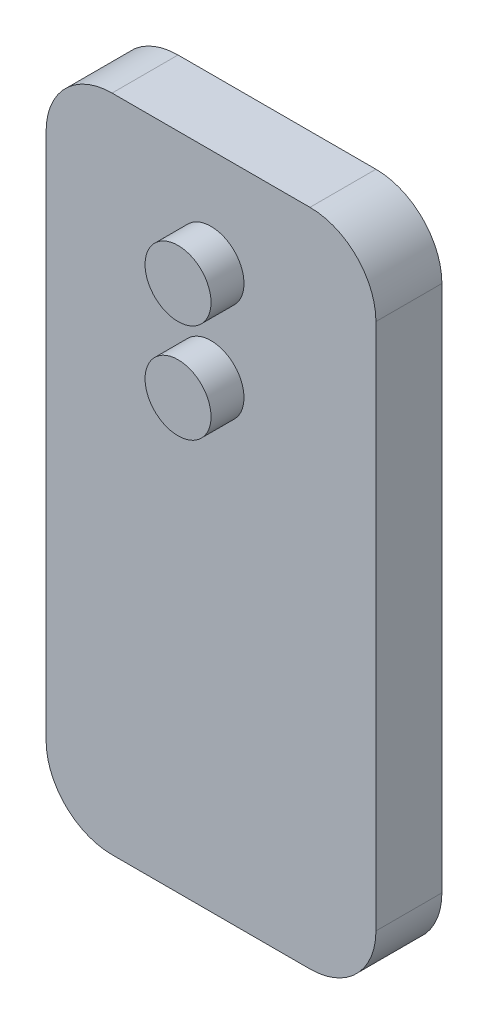
ISO-10303-21;
HEADER;
FILE_DESCRIPTION(('STEP AP214'),'2;1');
FILE_NAME('part.step','',(''),(''),'','','');
FILE_SCHEMA(('AUTOMOTIVE_DESIGN { 1 0 10303 214 1 1 1 1 }'));
ENDSEC;
DATA;
#1=APPLICATION_CONTEXT('core data for automotive mechanical design processes');
#2=APPLICATION_PROTOCOL_DEFINITION('international standard','automotive_design',2000,#1);
#3=PRODUCT_CONTEXT('',#1,'mechanical');
#4=PRODUCT('Part','Part','',(#3));
#5=PRODUCT_RELATED_PRODUCT_CATEGORY('part','',(#4));
#6=PRODUCT_DEFINITION_FORMATION('','',#4);
#7=PRODUCT_DEFINITION_CONTEXT('part definition',#1,'design');
#8=PRODUCT_DEFINITION('design','',#6,#7);
#9=PRODUCT_DEFINITION_SHAPE('','',#8);
#10=(LENGTH_UNIT() NAMED_UNIT(*) SI_UNIT(.MILLI.,.METRE.));
#11=(NAMED_UNIT(*) PLANE_ANGLE_UNIT() SI_UNIT($,.RADIAN.));
#12=(NAMED_UNIT(*) SI_UNIT($,.STERADIAN.) SOLID_ANGLE_UNIT());
#13=UNCERTAINTY_MEASURE_WITH_UNIT(LENGTH_MEASURE(1.E-05),#10,'distance_accuracy_value','');
#14=(GEOMETRIC_REPRESENTATION_CONTEXT(3) GLOBAL_UNCERTAINTY_ASSIGNED_CONTEXT((#13)) GLOBAL_UNIT_ASSIGNED_CONTEXT((#10,
#11,#12)) REPRESENTATION_CONTEXT('',''));
#15=CARTESIAN_POINT('',(0.,0.,0.));
#16=DIRECTION('',(0.,0.,1.));
#17=DIRECTION('',(1.,0.,0.));
#18=AXIS2_PLACEMENT_3D('',#15,#16,#17);
#19=CARTESIAN_POINT('',(-15.,10.,10.));
#20=DIRECTION('',(0.,0.,-1.));
#21=DIRECTION('',(-1.,0.,0.));
#22=AXIS2_PLACEMENT_3D('',#19,#20,#21);
#23=CYLINDRICAL_SURFACE('',#22,10.);
#24=CARTESIAN_POINT('',(-15.,10.,0.));
#25=DIRECTION('',(0.,0.,1.));
#26=DIRECTION('',(-1.,0.,0.));
#27=AXIS2_PLACEMENT_3D('',#24,#25,#26);
#28=CIRCLE('',#27,10.);
#29=CARTESIAN_POINT('',(-25.,10.,0.));
#30=VERTEX_POINT('',#29);
#31=CARTESIAN_POINT('',(-15.,0.,0.));
#32=VERTEX_POINT('',#31);
#33=EDGE_CURVE('E129',#30,#32,#28,.T.);
#34=ORIENTED_EDGE('',*,*,#33,.T.);
#35=DIRECTION('',(0.,0.,-1.));
#36=VECTOR('',#35,1.);
#37=CARTESIAN_POINT('',(-15.,0.,10.));
#38=LINE('',#37,#36);
#39=CARTESIAN_POINT('',(-15.,0.,10.));
#40=VERTEX_POINT('',#39);
#41=EDGE_CURVE('E157',#40,#32,#38,.T.);
#42=ORIENTED_EDGE('',*,*,#41,.F.);
#43=CARTESIAN_POINT('',(-15.,10.,10.));
#44=DIRECTION('',(0.,0.,1.));
#45=DIRECTION('',(-1.,0.,0.));
#46=AXIS2_PLACEMENT_3D('',#43,#44,#45);
#47=CIRCLE('',#46,10.);
#48=CARTESIAN_POINT('',(-25.,10.,10.));
#49=VERTEX_POINT('',#48);
#50=EDGE_CURVE('E144',#49,#40,#47,.T.);
#51=ORIENTED_EDGE('',*,*,#50,.F.);
#52=DIRECTION('',(0.,0.,-1.));
#53=VECTOR('',#52,1.);
#54=CARTESIAN_POINT('',(-25.,10.,10.));
#55=LINE('',#54,#53);
#56=EDGE_CURVE('E125',#49,#30,#55,.T.);
#57=ORIENTED_EDGE('',*,*,#56,.T.);
#58=EDGE_LOOP('',(#34,#42,#51,#57));
#59=FACE_BOUND('',#58,.T.);
#60=ADVANCED_FACE('F32',(#59),#23,.T.);
#61=CARTESIAN_POINT('',(-15.,0.,10.));
#62=DIRECTION('',(0.,1.,0.));
#63=DIRECTION('',(-1.,0.,0.));
#64=AXIS2_PLACEMENT_3D('',#61,#62,#63);
#65=PLANE('',#64);
#66=DIRECTION('',(1.,0.,0.));
#67=VECTOR('',#66,1.);
#68=CARTESIAN_POINT('',(-15.,0.,0.));
#69=LINE('',#68,#67);
#70=CARTESIAN_POINT('',(15.,0.,0.));
#71=VERTEX_POINT('',#70);
#72=EDGE_CURVE('E132',#32,#71,#69,.T.);
#73=ORIENTED_EDGE('',*,*,#72,.T.);
#74=DIRECTION('',(0.,0.,-1.));
#75=VECTOR('',#74,1.);
#76=CARTESIAN_POINT('',(15.,0.,10.));
#77=LINE('',#76,#75);
#78=CARTESIAN_POINT('',(15.,0.,10.));
#79=VERTEX_POINT('',#78);
#80=EDGE_CURVE('E154',#79,#71,#77,.T.);
#81=ORIENTED_EDGE('',*,*,#80,.F.);
#82=DIRECTION('',(1.,0.,0.));
#83=VECTOR('',#82,1.);
#84=CARTESIAN_POINT('',(-15.,0.,10.));
#85=LINE('',#84,#83);
#86=EDGE_CURVE('E92',#40,#79,#85,.T.);
#87=ORIENTED_EDGE('',*,*,#86,.F.);
#88=ORIENTED_EDGE('',*,*,#41,.T.);
#89=EDGE_LOOP('',(#73,#81,#87,#88));
#90=FACE_BOUND('',#89,.T.);
#91=ADVANCED_FACE('F178',(#90),#65,.F.);
#92=CARTESIAN_POINT('',(15.,10.,10.));
#93=DIRECTION('',(0.,0.,-1.));
#94=DIRECTION('',(-1.,0.,0.));
#95=AXIS2_PLACEMENT_3D('',#92,#93,#94);
#96=CYLINDRICAL_SURFACE('',#95,10.);
#97=CARTESIAN_POINT('',(15.,10.,0.));
#98=DIRECTION('',(0.,0.,1.));
#99=DIRECTION('',(1.,0.,0.));
#100=AXIS2_PLACEMENT_3D('',#97,#98,#99);
#101=CIRCLE('',#100,10.);
#102=CARTESIAN_POINT('',(25.,10.,0.));
#103=VERTEX_POINT('',#102);
#104=EDGE_CURVE('E135',#71,#103,#101,.T.);
#105=ORIENTED_EDGE('',*,*,#104,.T.);
#106=DIRECTION('',(0.,0.,-1.));
#107=VECTOR('',#106,1.);
#108=CARTESIAN_POINT('',(25.,10.,10.));
#109=LINE('',#108,#107);
#110=CARTESIAN_POINT('',(25.,10.,10.));
#111=VERTEX_POINT('',#110);
#112=EDGE_CURVE('E151',#111,#103,#109,.T.);
#113=ORIENTED_EDGE('',*,*,#112,.F.);
#114=CARTESIAN_POINT('',(15.,10.,10.));
#115=DIRECTION('',(0.,0.,1.));
#116=DIRECTION('',(1.,0.,0.));
#117=AXIS2_PLACEMENT_3D('',#114,#115,#116);
#118=CIRCLE('',#117,10.);
#119=EDGE_CURVE('E192',#79,#111,#118,.T.);
#120=ORIENTED_EDGE('',*,*,#119,.F.);
#121=ORIENTED_EDGE('',*,*,#80,.T.);
#122=EDGE_LOOP('',(#105,#113,#120,#121));
#123=FACE_BOUND('',#122,.T.);
#124=ADVANCED_FACE('F183',(#123),#96,.T.);
#125=CARTESIAN_POINT('',(25.,10.,10.));
#126=DIRECTION('',(-1.,0.,0.));
#127=DIRECTION('',(0.,-1.,0.));
#128=AXIS2_PLACEMENT_3D('',#125,#126,#127);
#129=PLANE('',#128);
#130=DIRECTION('',(0.,1.,0.));
#131=VECTOR('',#130,1.);
#132=CARTESIAN_POINT('',(25.,10.,0.));
#133=LINE('',#132,#131);
#134=CARTESIAN_POINT('',(25.,90.,0.));
#135=VERTEX_POINT('',#134);
#136=EDGE_CURVE('E137',#103,#135,#133,.T.);
#137=ORIENTED_EDGE('',*,*,#136,.T.);
#138=DIRECTION('',(0.,0.,-1.));
#139=VECTOR('',#138,1.);
#140=CARTESIAN_POINT('',(25.,90.,10.));
#141=LINE('',#140,#139);
#142=CARTESIAN_POINT('',(25.,90.,10.));
#143=VERTEX_POINT('',#142);
#144=EDGE_CURVE('E148',#143,#135,#141,.T.);
#145=ORIENTED_EDGE('',*,*,#144,.F.);
#146=DIRECTION('',(0.,1.,0.));
#147=VECTOR('',#146,1.);
#148=CARTESIAN_POINT('',(25.,10.,10.));
#149=LINE('',#148,#147);
#150=EDGE_CURVE('E194',#111,#143,#149,.T.);
#151=ORIENTED_EDGE('',*,*,#150,.F.);
#152=ORIENTED_EDGE('',*,*,#112,.T.);
#153=EDGE_LOOP('',(#137,#145,#151,#152));
#154=FACE_BOUND('',#153,.T.);
#155=ADVANCED_FACE('F281',(#154),#129,.F.);
#156=CARTESIAN_POINT('',(15.,90.,10.));
#157=DIRECTION('',(0.,0.,-1.));
#158=DIRECTION('',(-1.,0.,0.));
#159=AXIS2_PLACEMENT_3D('',#156,#157,#158);
#160=CYLINDRICAL_SURFACE('',#159,9.99999999999999);
#161=CARTESIAN_POINT('',(15.,90.,0.));
#162=DIRECTION('',(0.,0.,1.));
#163=DIRECTION('',(-1.,0.,0.));
#164=AXIS2_PLACEMENT_3D('',#161,#162,#163);
#165=CIRCLE('',#164,9.99999999999999);
#166=CARTESIAN_POINT('',(15.,100.,0.));
#167=VERTEX_POINT('',#166);
#168=EDGE_CURVE('E139',#135,#167,#165,.T.);
#169=ORIENTED_EDGE('',*,*,#168,.T.);
#170=DIRECTION('',(0.,0.,-1.));
#171=VECTOR('',#170,1.);
#172=CARTESIAN_POINT('',(15.,100.,10.));
#173=LINE('',#172,#171);
#174=CARTESIAN_POINT('',(15.,100.,10.));
#175=VERTEX_POINT('',#174);
#176=EDGE_CURVE('E120',#175,#167,#173,.T.);
#177=ORIENTED_EDGE('',*,*,#176,.F.);
#178=CARTESIAN_POINT('',(15.,90.,10.));
#179=DIRECTION('',(0.,0.,1.));
#180=DIRECTION('',(-1.,0.,0.));
#181=AXIS2_PLACEMENT_3D('',#178,#179,#180);
#182=CIRCLE('',#181,9.99999999999999);
#183=EDGE_CURVE('E111',#143,#175,#182,.T.);
#184=ORIENTED_EDGE('',*,*,#183,.F.);
#185=ORIENTED_EDGE('',*,*,#144,.T.);
#186=EDGE_LOOP('',(#169,#177,#184,#185));
#187=FACE_BOUND('',#186,.T.);
#188=ADVANCED_FACE('F273',(#187),#160,.T.);
#189=CARTESIAN_POINT('',(15.,100.,10.));
#190=DIRECTION('',(0.,-1.,0.));
#191=DIRECTION('',(0.,0.,-1.));
#192=AXIS2_PLACEMENT_3D('',#189,#190,#191);
#193=PLANE('',#192);
#194=DIRECTION('',(-1.,0.,0.));
#195=VECTOR('',#194,1.);
#196=CARTESIAN_POINT('',(15.,100.,0.));
#197=LINE('',#196,#195);
#198=CARTESIAN_POINT('',(-15.,100.,0.));
#199=VERTEX_POINT('',#198);
#200=EDGE_CURVE('E119',#167,#199,#197,.T.);
#201=ORIENTED_EDGE('',*,*,#200,.T.);
#202=DIRECTION('',(0.,0.,-1.));
#203=VECTOR('',#202,1.);
#204=CARTESIAN_POINT('',(-15.,100.,10.));
#205=LINE('',#204,#203);
#206=CARTESIAN_POINT('',(-15.,100.,10.));
#207=VERTEX_POINT('',#206);
#208=EDGE_CURVE('E116',#207,#199,#205,.T.);
#209=ORIENTED_EDGE('',*,*,#208,.F.);
#210=DIRECTION('',(-1.,0.,0.));
#211=VECTOR('',#210,1.);
#212=CARTESIAN_POINT('',(15.,100.,10.));
#213=LINE('',#212,#211);
#214=EDGE_CURVE('E105',#175,#207,#213,.T.);
#215=ORIENTED_EDGE('',*,*,#214,.F.);
#216=ORIENTED_EDGE('',*,*,#176,.T.);
#217=EDGE_LOOP('',(#201,#209,#215,#216));
#218=FACE_BOUND('',#217,.T.);
#219=ADVANCED_FACE('F117',(#218),#193,.F.);
#220=CARTESIAN_POINT('',(-15.,90.,10.));
#221=DIRECTION('',(0.,0.,-1.));
#222=DIRECTION('',(-1.,0.,0.));
#223=AXIS2_PLACEMENT_3D('',#220,#221,#222);
#224=CYLINDRICAL_SURFACE('',#223,9.99999999999999);
#225=CARTESIAN_POINT('',(-15.,90.,0.));
#226=DIRECTION('',(0.,0.,1.));
#227=DIRECTION('',(-1.,0.,0.));
#228=AXIS2_PLACEMENT_3D('',#225,#226,#227);
#229=CIRCLE('',#228,9.99999999999999);
#230=CARTESIAN_POINT('',(-25.,90.,0.));
#231=VERTEX_POINT('',#230);
#232=EDGE_CURVE('E77',#199,#231,#229,.T.);
#233=ORIENTED_EDGE('',*,*,#232,.T.);
#234=DIRECTION('',(0.,0.,-1.));
#235=VECTOR('',#234,1.);
#236=CARTESIAN_POINT('',(-25.,90.,10.));
#237=LINE('',#236,#235);
#238=CARTESIAN_POINT('',(-25.,90.,10.));
#239=VERTEX_POINT('',#238);
#240=EDGE_CURVE('E121',#239,#231,#237,.T.);
#241=ORIENTED_EDGE('',*,*,#240,.F.);
#242=CARTESIAN_POINT('',(-15.,90.,10.));
#243=DIRECTION('',(0.,0.,1.));
#244=DIRECTION('',(-1.,0.,0.));
#245=AXIS2_PLACEMENT_3D('',#242,#243,#244);
#246=CIRCLE('',#245,9.99999999999999);
#247=EDGE_CURVE('E109',#207,#239,#246,.T.);
#248=ORIENTED_EDGE('',*,*,#247,.F.);
#249=ORIENTED_EDGE('',*,*,#208,.T.);
#250=EDGE_LOOP('',(#233,#241,#248,#249));
#251=FACE_BOUND('',#250,.T.);
#252=ADVANCED_FACE('F123',(#251),#224,.T.);
#253=CARTESIAN_POINT('',(-25.,90.,10.));
#254=DIRECTION('',(1.,0.,0.));
#255=DIRECTION('',(0.,1.,0.));
#256=AXIS2_PLACEMENT_3D('',#253,#254,#255);
#257=PLANE('',#256);
#258=DIRECTION('',(0.,-1.,0.));
#259=VECTOR('',#258,1.);
#260=CARTESIAN_POINT('',(-25.,90.,0.));
#261=LINE('',#260,#259);
#262=EDGE_CURVE('E83',#231,#30,#261,.T.);
#263=ORIENTED_EDGE('',*,*,#262,.T.);
#264=ORIENTED_EDGE('',*,*,#56,.F.);
#265=DIRECTION('',(0.,-1.,0.));
#266=VECTOR('',#265,1.);
#267=CARTESIAN_POINT('',(-25.,90.,10.));
#268=LINE('',#267,#266);
#269=EDGE_CURVE('E48',#239,#49,#268,.T.);
#270=ORIENTED_EDGE('',*,*,#269,.F.);
#271=ORIENTED_EDGE('',*,*,#240,.T.);
#272=EDGE_LOOP('',(#263,#264,#270,#271));
#273=FACE_BOUND('',#272,.T.);
#274=ADVANCED_FACE('F165',(#273),#257,.F.);
#275=CARTESIAN_POINT('',(-15.,10.,10.));
#276=DIRECTION('',(0.,0.,-1.));
#277=DIRECTION('',(-1.,0.,0.));
#278=AXIS2_PLACEMENT_3D('',#275,#276,#277);
#279=PLANE('',#278);
#280=CARTESIAN_POINT('',(0.,70.,10.));
#281=DIRECTION('',(0.,0.,-1.));
#282=DIRECTION('',(-1.,0.,0.));
#283=AXIS2_PLACEMENT_3D('',#280,#281,#282);
#284=CIRCLE('',#283,5.);
#285=CARTESIAN_POINT('',(-5.,70.,10.));
#286=VERTEX_POINT('',#285);
#287=EDGE_CURVE('E11',#286,#286,#284,.F.);
#288=ORIENTED_EDGE('',*,*,#287,.F.);
#289=EDGE_LOOP('',(#288));
#290=FACE_BOUND('',#289,.T.);
#291=CARTESIAN_POINT('',(0.,85.,10.));
#292=DIRECTION('',(0.,0.,-1.));
#293=DIRECTION('',(-1.,0.,0.));
#294=AXIS2_PLACEMENT_3D('',#291,#292,#293);
#295=CIRCLE('',#294,5.);
#296=CARTESIAN_POINT('',(-5.,85.,10.));
#297=VERTEX_POINT('',#296);
#298=EDGE_CURVE('E40',#297,#297,#295,.F.);
#299=ORIENTED_EDGE('',*,*,#298,.F.);
#300=EDGE_LOOP('',(#299));
#301=FACE_BOUND('',#300,.T.);
#302=ORIENTED_EDGE('',*,*,#50,.T.);
#303=ORIENTED_EDGE('',*,*,#86,.T.);
#304=ORIENTED_EDGE('',*,*,#119,.T.);
#305=ORIENTED_EDGE('',*,*,#150,.T.);
#306=ORIENTED_EDGE('',*,*,#183,.T.);
#307=ORIENTED_EDGE('',*,*,#214,.T.);
#308=ORIENTED_EDGE('',*,*,#247,.T.);
#309=ORIENTED_EDGE('',*,*,#269,.T.);
#310=EDGE_LOOP('',(#302,#303,#304,#305,#306,#307,#308,#309));
#311=FACE_BOUND('',#310,.T.);
#312=ADVANCED_FACE('F107',(#290,#301,#311),#279,.F.);
#313=CARTESIAN_POINT('',(-15.,10.,0.));
#314=DIRECTION('',(0.,0.,-1.));
#315=DIRECTION('',(-1.,0.,0.));
#316=AXIS2_PLACEMENT_3D('',#313,#314,#315);
#317=PLANE('',#316);
#318=ORIENTED_EDGE('',*,*,#33,.F.);
#319=ORIENTED_EDGE('',*,*,#262,.F.);
#320=ORIENTED_EDGE('',*,*,#232,.F.);
#321=ORIENTED_EDGE('',*,*,#200,.F.);
#322=ORIENTED_EDGE('',*,*,#168,.F.);
#323=ORIENTED_EDGE('',*,*,#136,.F.);
#324=ORIENTED_EDGE('',*,*,#104,.F.);
#325=ORIENTED_EDGE('',*,*,#72,.F.);
#326=EDGE_LOOP('',(#318,#319,#320,#321,#322,#323,#324,#325));
#327=FACE_BOUND('',#326,.T.);
#328=ADVANCED_FACE('F164',(#327),#317,.T.);
#329=CARTESIAN_POINT('',(0.,85.,15.));
#330=DIRECTION('',(0.,0.,-1.));
#331=DIRECTION('',(-1.,0.,0.));
#332=AXIS2_PLACEMENT_3D('',#329,#330,#331);
#333=CYLINDRICAL_SURFACE('',#332,5.);
#334=CARTESIAN_POINT('',(0.,85.,15.));
#335=DIRECTION('',(0.,0.,1.));
#336=DIRECTION('',(1.,0.,0.));
#337=AXIS2_PLACEMENT_3D('',#334,#335,#336);
#338=CIRCLE('',#337,5.);
#339=CARTESIAN_POINT('',(5.,85.,15.));
#340=VERTEX_POINT('',#339);
#341=EDGE_CURVE('E133',#340,#340,#338,.T.);
#342=ORIENTED_EDGE('',*,*,#341,.F.);
#343=EDGE_LOOP('',(#342));
#344=FACE_BOUND('',#343,.T.);
#345=ORIENTED_EDGE('',*,*,#298,.T.);
#346=EDGE_LOOP('',(#345));
#347=FACE_BOUND('',#346,.T.);
#348=ADVANCED_FACE('F161',(#344,#347),#333,.T.);
#349=CARTESIAN_POINT('',(0.,85.,15.));
#350=DIRECTION('',(0.,0.,1.));
#351=DIRECTION('',(1.,0.,0.));
#352=AXIS2_PLACEMENT_3D('',#349,#350,#351);
#353=PLANE('',#352);
#354=ORIENTED_EDGE('',*,*,#341,.T.);
#355=EDGE_LOOP('',(#354));
#356=FACE_BOUND('',#355,.T.);
#357=ADVANCED_FACE('F211',(#356),#353,.T.);
#358=CARTESIAN_POINT('',(0.,70.,15.));
#359=DIRECTION('',(0.,0.,-1.));
#360=DIRECTION('',(-1.,0.,0.));
#361=AXIS2_PLACEMENT_3D('',#358,#359,#360);
#362=CYLINDRICAL_SURFACE('',#361,5.);
#363=CARTESIAN_POINT('',(0.,70.,15.));
#364=DIRECTION('',(0.,0.,1.));
#365=DIRECTION('',(1.,0.,0.));
#366=AXIS2_PLACEMENT_3D('',#363,#364,#365);
#367=CIRCLE('',#366,5.);
#368=CARTESIAN_POINT('',(5.00000000000001,70.,15.));
#369=VERTEX_POINT('',#368);
#370=EDGE_CURVE('E202',#369,#369,#367,.T.);
#371=ORIENTED_EDGE('',*,*,#370,.F.);
#372=EDGE_LOOP('',(#371));
#373=FACE_BOUND('',#372,.T.);
#374=ORIENTED_EDGE('',*,*,#287,.T.);
#375=EDGE_LOOP('',(#374));
#376=FACE_BOUND('',#375,.T.);
#377=ADVANCED_FACE('F208',(#373,#376),#362,.T.);
#378=CARTESIAN_POINT('',(0.,70.,15.));
#379=DIRECTION('',(0.,0.,1.));
#380=DIRECTION('',(1.,0.,0.));
#381=AXIS2_PLACEMENT_3D('',#378,#379,#380);
#382=PLANE('',#381);
#383=ORIENTED_EDGE('',*,*,#370,.T.);
#384=EDGE_LOOP('',(#383));
#385=FACE_BOUND('',#384,.T.);
#386=ADVANCED_FACE('F206',(#385),#382,.T.);
#387=CLOSED_SHELL('',(#60,#91,#124,#155,#188,#219,#252,#274,#312,#328,#348,#357,#377,#386));
#388=MANIFOLD_SOLID_BREP('B2',#387);
#389=ADVANCED_BREP_SHAPE_REPRESENTATION('',(#18,#388),#14);
#390=SHAPE_DEFINITION_REPRESENTATION(#9,#389);
ENDSEC;
END-ISO-10303-21;
